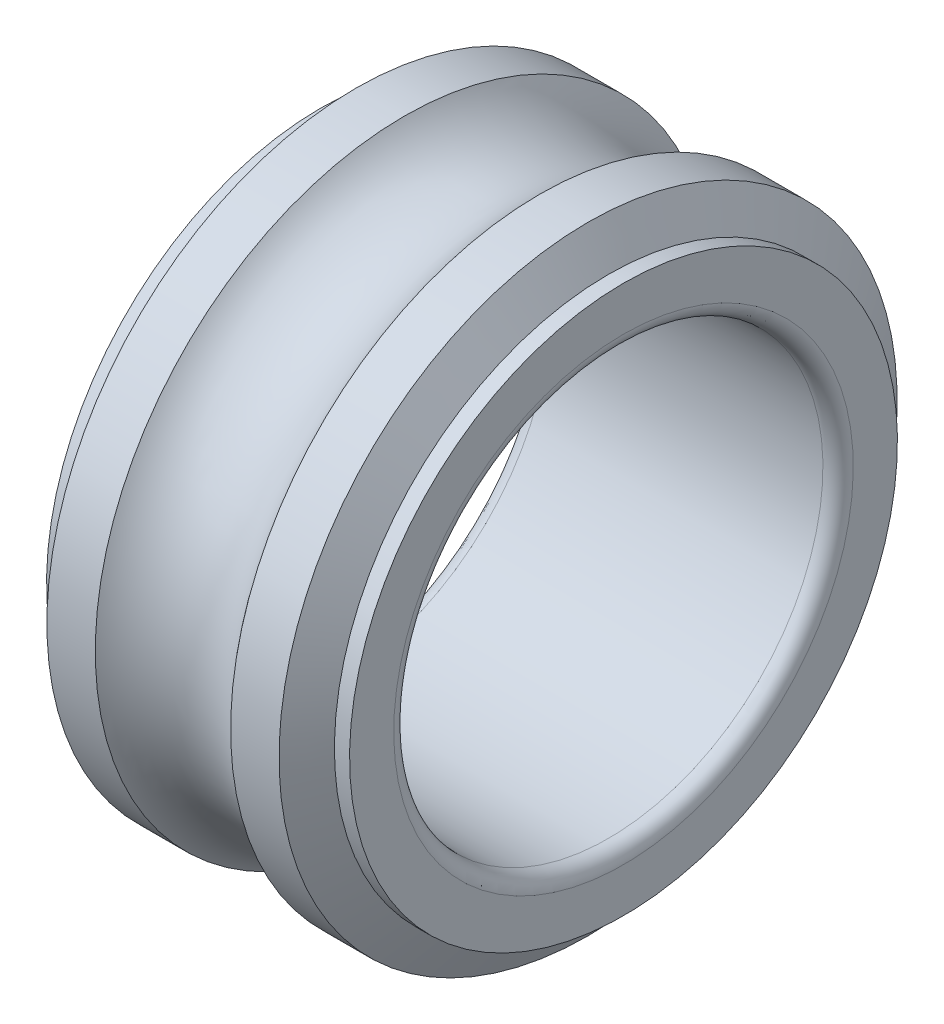
ISO-10303-21;
HEADER;
FILE_DESCRIPTION(('STEP AP214'),'2;1');
FILE_NAME('part.step','',(''),(''),'','','');
FILE_SCHEMA(('AUTOMOTIVE_DESIGN { 1 0 10303 214 1 1 1 1 }'));
ENDSEC;
DATA;
#1=APPLICATION_CONTEXT('core data for automotive mechanical design processes');
#2=APPLICATION_PROTOCOL_DEFINITION('international standard','automotive_design',2000,#1);
#3=PRODUCT_CONTEXT('',#1,'mechanical');
#4=PRODUCT('Part','Part','',(#3));
#5=PRODUCT_RELATED_PRODUCT_CATEGORY('part','',(#4));
#6=PRODUCT_DEFINITION_FORMATION('','',#4);
#7=PRODUCT_DEFINITION_CONTEXT('part definition',#1,'design');
#8=PRODUCT_DEFINITION('design','',#6,#7);
#9=PRODUCT_DEFINITION_SHAPE('','',#8);
#10=(LENGTH_UNIT() NAMED_UNIT(*) SI_UNIT(.MILLI.,.METRE.));
#11=(NAMED_UNIT(*) PLANE_ANGLE_UNIT() SI_UNIT($,.RADIAN.));
#12=(NAMED_UNIT(*) SI_UNIT($,.STERADIAN.) SOLID_ANGLE_UNIT());
#13=UNCERTAINTY_MEASURE_WITH_UNIT(LENGTH_MEASURE(1.E-05),#10,'distance_accuracy_value','');
#14=(GEOMETRIC_REPRESENTATION_CONTEXT(3) GLOBAL_UNCERTAINTY_ASSIGNED_CONTEXT((#13)) GLOBAL_UNIT_ASSIGNED_CONTEXT((#10,
#11,#12)) REPRESENTATION_CONTEXT('',''));
#15=CARTESIAN_POINT('',(0.,0.,0.));
#16=DIRECTION('',(0.,0.,1.));
#17=DIRECTION('',(1.,0.,0.));
#18=AXIS2_PLACEMENT_3D('',#15,#16,#17);
#19=CARTESIAN_POINT('',(6.9096853907283,0.,0.));
#20=DIRECTION('',(-1.,0.,0.));
#21=DIRECTION('',(0.,1.,0.));
#22=AXIS2_PLACEMENT_3D('',#19,#20,#21);
#23=CYLINDRICAL_SURFACE('',#22,3.06);
#24=CARTESIAN_POINT('',(6.67,0.,0.));
#25=DIRECTION('',(1.,0.,0.));
#26=DIRECTION('',(0.,1.,0.));
#27=AXIS2_PLACEMENT_3D('',#24,#25,#26);
#28=CIRCLE('',#27,3.06);
#29=CARTESIAN_POINT('',(6.67,3.06,0.));
#30=VERTEX_POINT('',#29);
#31=EDGE_CURVE('E11',#30,#30,#28,.T.);
#32=ORIENTED_EDGE('',*,*,#31,.T.);
#33=EDGE_LOOP('',(#32));
#34=FACE_BOUND('',#33,.T.);
#35=CARTESIAN_POINT('',(7.1493707814566,0.,0.));
#36=DIRECTION('',(1.,0.,0.));
#37=DIRECTION('',(0.,1.,0.));
#38=AXIS2_PLACEMENT_3D('',#35,#36,#37);
#39=CIRCLE('',#38,3.06);
#40=CARTESIAN_POINT('',(7.1493707814566,3.06,0.));
#41=VERTEX_POINT('',#40);
#42=EDGE_CURVE('E92',#41,#41,#39,.T.);
#43=ORIENTED_EDGE('',*,*,#42,.F.);
#44=EDGE_LOOP('',(#43));
#45=FACE_BOUND('',#44,.T.);
#46=ADVANCED_FACE('F34',(#34,#45),#23,.T.);
#47=CARTESIAN_POINT('',(6.,0.,0.));
#48=DIRECTION('',(1.,0.,0.));
#49=DIRECTION('',(0.,0.,-1.));
#50=AXIS2_PLACEMENT_3D('',#47,#48,#49);
#51=TOROIDAL_SURFACE('',#50,3.5625,0.8375);
#52=CARTESIAN_POINT('',(5.33,0.,0.));
#53=DIRECTION('',(1.,0.,0.));
#54=DIRECTION('',(0.,1.,0.));
#55=AXIS2_PLACEMENT_3D('',#52,#53,#54);
#56=CIRCLE('',#55,3.06);
#57=CARTESIAN_POINT('',(5.33,3.06,0.));
#58=VERTEX_POINT('',#57);
#59=EDGE_CURVE('E43',#58,#58,#56,.T.);
#60=ORIENTED_EDGE('',*,*,#59,.T.);
#61=EDGE_LOOP('',(#60));
#62=FACE_BOUND('',#61,.T.);
#63=ORIENTED_EDGE('',*,*,#31,.F.);
#64=EDGE_LOOP('',(#63));
#65=FACE_BOUND('',#64,.T.);
#66=ADVANCED_FACE('F112',(#62,#65),#51,.F.);
#67=CARTESIAN_POINT('',(5.0903146092717,0.,0.));
#68=DIRECTION('',(-1.,0.,0.));
#69=DIRECTION('',(0.,1.,0.));
#70=AXIS2_PLACEMENT_3D('',#67,#68,#69);
#71=CYLINDRICAL_SURFACE('',#70,3.06);
#72=CARTESIAN_POINT('',(4.85062921854339,0.,0.));
#73=DIRECTION('',(1.,0.,0.));
#74=DIRECTION('',(0.,1.,0.));
#75=AXIS2_PLACEMENT_3D('',#72,#73,#74);
#76=CIRCLE('',#75,3.06);
#77=CARTESIAN_POINT('',(4.85062921854339,3.06,0.));
#78=VERTEX_POINT('',#77);
#79=EDGE_CURVE('E96',#78,#78,#76,.T.);
#80=ORIENTED_EDGE('',*,*,#79,.T.);
#81=EDGE_LOOP('',(#80));
#82=FACE_BOUND('',#81,.T.);
#83=ORIENTED_EDGE('',*,*,#59,.F.);
#84=EDGE_LOOP('',(#83));
#85=FACE_BOUND('',#84,.T.);
#86=ADVANCED_FACE('F117',(#82,#85),#71,.T.);
#87=CARTESIAN_POINT('',(4.7503146092717,0.,0.));
#88=DIRECTION('',(1.,0.,0.));
#89=DIRECTION('',(0.,1.,0.));
#90=AXIS2_PLACEMENT_3D('',#87,#88,#89);
#91=CONICAL_SURFACE('',#90,2.88625,1.0471975511966);
#92=CARTESIAN_POINT('',(4.65,0.,0.));
#93=DIRECTION('',(1.,0.,0.));
#94=DIRECTION('',(0.,1.,0.));
#95=AXIS2_PLACEMENT_3D('',#92,#93,#94);
#96=CIRCLE('',#95,2.7125);
#97=CARTESIAN_POINT('',(4.65,2.7125,0.));
#98=VERTEX_POINT('',#97);
#99=EDGE_CURVE('E102',#98,#98,#96,.T.);
#100=ORIENTED_EDGE('',*,*,#99,.T.);
#101=EDGE_LOOP('',(#100));
#102=FACE_BOUND('',#101,.T.);
#103=ORIENTED_EDGE('',*,*,#79,.F.);
#104=EDGE_LOOP('',(#103));
#105=FACE_BOUND('',#104,.T.);
#106=ADVANCED_FACE('F126',(#102,#105),#91,.T.);
#107=CARTESIAN_POINT('',(4.575,0.,0.));
#108=DIRECTION('',(-1.,0.,0.));
#109=DIRECTION('',(0.,1.,0.));
#110=AXIS2_PLACEMENT_3D('',#107,#108,#109);
#111=CYLINDRICAL_SURFACE('',#110,2.7125);
#112=CARTESIAN_POINT('',(4.5,0.,0.));
#113=DIRECTION('',(1.,0.,0.));
#114=DIRECTION('',(0.,1.,0.));
#115=AXIS2_PLACEMENT_3D('',#112,#113,#114);
#116=CIRCLE('',#115,2.7125);
#117=CARTESIAN_POINT('',(4.5,2.7125,0.));
#118=VERTEX_POINT('',#117);
#119=EDGE_CURVE('E38',#118,#118,#116,.T.);
#120=ORIENTED_EDGE('',*,*,#119,.T.);
#121=EDGE_LOOP('',(#120));
#122=FACE_BOUND('',#121,.T.);
#123=ORIENTED_EDGE('',*,*,#99,.F.);
#124=EDGE_LOOP('',(#123));
#125=FACE_BOUND('',#124,.T.);
#126=ADVANCED_FACE('F129',(#122,#125),#111,.T.);
#127=CARTESIAN_POINT('',(4.5,2.49375,0.));
#128=DIRECTION('',(-1.,0.,0.));
#129=DIRECTION('',(0.,-1.,0.));
#130=AXIS2_PLACEMENT_3D('',#127,#128,#129);
#131=PLANE('',#130);
#132=CARTESIAN_POINT('',(4.5,0.,0.));
#133=DIRECTION('',(1.,0.,0.));
#134=DIRECTION('',(0.,1.,0.));
#135=AXIS2_PLACEMENT_3D('',#132,#133,#134);
#136=CIRCLE('',#135,2.275);
#137=CARTESIAN_POINT('',(4.5,2.275,0.));
#138=VERTEX_POINT('',#137);
#139=EDGE_CURVE('E97',#138,#138,#136,.T.);
#140=ORIENTED_EDGE('',*,*,#139,.T.);
#141=EDGE_LOOP('',(#140));
#142=FACE_BOUND('',#141,.T.);
#143=ORIENTED_EDGE('',*,*,#119,.F.);
#144=EDGE_LOOP('',(#143));
#145=FACE_BOUND('',#144,.T.);
#146=ADVANCED_FACE('F137',(#142,#145),#131,.T.);
#147=CARTESIAN_POINT('',(4.65,0.,0.));
#148=DIRECTION('',(1.,0.,0.));
#149=DIRECTION('',(0.,0.,-1.));
#150=AXIS2_PLACEMENT_3D('',#147,#148,#149);
#151=TOROIDAL_SURFACE('',#150,2.275,0.15);
#152=CARTESIAN_POINT('',(4.65,0.,0.));
#153=DIRECTION('',(1.,0.,0.));
#154=DIRECTION('',(0.,1.,0.));
#155=AXIS2_PLACEMENT_3D('',#152,#153,#154);
#156=CIRCLE('',#155,2.125);
#157=CARTESIAN_POINT('',(4.65,2.125,0.));
#158=VERTEX_POINT('',#157);
#159=EDGE_CURVE('E91',#158,#158,#156,.T.);
#160=ORIENTED_EDGE('',*,*,#159,.T.);
#161=EDGE_LOOP('',(#160));
#162=FACE_BOUND('',#161,.T.);
#163=ORIENTED_EDGE('',*,*,#139,.F.);
#164=EDGE_LOOP('',(#163));
#165=FACE_BOUND('',#164,.T.);
#166=ADVANCED_FACE('F134',(#162,#165),#151,.T.);
#167=CARTESIAN_POINT('',(6.,0.,0.));
#168=DIRECTION('',(-1.,0.,0.));
#169=DIRECTION('',(0.,1.,0.));
#170=AXIS2_PLACEMENT_3D('',#167,#168,#169);
#171=CYLINDRICAL_SURFACE('',#170,2.125);
#172=CARTESIAN_POINT('',(7.35,0.,0.));
#173=DIRECTION('',(1.,0.,0.));
#174=DIRECTION('',(0.,1.,0.));
#175=AXIS2_PLACEMENT_3D('',#172,#173,#174);
#176=CIRCLE('',#175,2.125);
#177=CARTESIAN_POINT('',(7.35,2.125,0.));
#178=VERTEX_POINT('',#177);
#179=EDGE_CURVE('E89',#178,#178,#176,.T.);
#180=ORIENTED_EDGE('',*,*,#179,.T.);
#181=EDGE_LOOP('',(#180));
#182=FACE_BOUND('',#181,.T.);
#183=ORIENTED_EDGE('',*,*,#159,.F.);
#184=EDGE_LOOP('',(#183));
#185=FACE_BOUND('',#184,.T.);
#186=ADVANCED_FACE('F36',(#182,#185),#171,.F.);
#187=CARTESIAN_POINT('',(7.35,0.,0.));
#188=DIRECTION('',(1.,0.,0.));
#189=DIRECTION('',(0.,0.,-1.));
#190=AXIS2_PLACEMENT_3D('',#187,#188,#189);
#191=TOROIDAL_SURFACE('',#190,2.275,0.15);
#192=CARTESIAN_POINT('',(7.5,0.,0.));
#193=DIRECTION('',(1.,0.,0.));
#194=DIRECTION('',(0.,1.,0.));
#195=AXIS2_PLACEMENT_3D('',#192,#193,#194);
#196=CIRCLE('',#195,2.275);
#197=CARTESIAN_POINT('',(7.5,2.275,0.));
#198=VERTEX_POINT('',#197);
#199=EDGE_CURVE('E85',#198,#198,#196,.T.);
#200=ORIENTED_EDGE('',*,*,#199,.T.);
#201=EDGE_LOOP('',(#200));
#202=FACE_BOUND('',#201,.T.);
#203=ORIENTED_EDGE('',*,*,#179,.F.);
#204=EDGE_LOOP('',(#203));
#205=FACE_BOUND('',#204,.T.);
#206=ADVANCED_FACE('F86',(#202,#205),#191,.T.);
#207=CARTESIAN_POINT('',(7.5,2.49375,0.));
#208=DIRECTION('',(1.,0.,0.));
#209=DIRECTION('',(0.,1.,0.));
#210=AXIS2_PLACEMENT_3D('',#207,#208,#209);
#211=PLANE('',#210);
#212=CARTESIAN_POINT('',(7.5,0.,0.));
#213=DIRECTION('',(1.,0.,0.));
#214=DIRECTION('',(0.,1.,0.));
#215=AXIS2_PLACEMENT_3D('',#212,#213,#214);
#216=CIRCLE('',#215,2.7125);
#217=CARTESIAN_POINT('',(7.5,2.7125,0.));
#218=VERTEX_POINT('',#217);
#219=EDGE_CURVE('E81',#218,#218,#216,.T.);
#220=ORIENTED_EDGE('',*,*,#219,.T.);
#221=EDGE_LOOP('',(#220));
#222=FACE_BOUND('',#221,.T.);
#223=ORIENTED_EDGE('',*,*,#199,.F.);
#224=EDGE_LOOP('',(#223));
#225=FACE_BOUND('',#224,.T.);
#226=ADVANCED_FACE('F124',(#222,#225),#211,.T.);
#227=CARTESIAN_POINT('',(7.425,0.,0.));
#228=DIRECTION('',(-1.,0.,0.));
#229=DIRECTION('',(0.,1.,0.));
#230=AXIS2_PLACEMENT_3D('',#227,#228,#229);
#231=CYLINDRICAL_SURFACE('',#230,2.7125);
#232=CARTESIAN_POINT('',(7.35,0.,0.));
#233=DIRECTION('',(1.,0.,0.));
#234=DIRECTION('',(0.,1.,0.));
#235=AXIS2_PLACEMENT_3D('',#232,#233,#234);
#236=CIRCLE('',#235,2.7125);
#237=CARTESIAN_POINT('',(7.35,2.7125,0.));
#238=VERTEX_POINT('',#237);
#239=EDGE_CURVE('E100',#238,#238,#236,.T.);
#240=ORIENTED_EDGE('',*,*,#239,.T.);
#241=EDGE_LOOP('',(#240));
#242=FACE_BOUND('',#241,.T.);
#243=ORIENTED_EDGE('',*,*,#219,.F.);
#244=EDGE_LOOP('',(#243));
#245=FACE_BOUND('',#244,.T.);
#246=ADVANCED_FACE('F122',(#242,#245),#231,.T.);
#247=CARTESIAN_POINT('',(7.2496853907283,0.,0.));
#248=DIRECTION('',(-1.,0.,0.));
#249=DIRECTION('',(0.,1.,0.));
#250=AXIS2_PLACEMENT_3D('',#247,#248,#249);
#251=CONICAL_SURFACE('',#250,2.88625,1.0471975511966);
#252=ORIENTED_EDGE('',*,*,#42,.T.);
#253=EDGE_LOOP('',(#252));
#254=FACE_BOUND('',#253,.T.);
#255=ORIENTED_EDGE('',*,*,#239,.F.);
#256=EDGE_LOOP('',(#255));
#257=FACE_BOUND('',#256,.T.);
#258=ADVANCED_FACE('F108',(#254,#257),#251,.T.);
#259=CLOSED_SHELL('',(#46,#66,#86,#106,#126,#146,#166,#186,#206,#226,#246,#258));
#260=MANIFOLD_SOLID_BREP('B2',#259);
#261=ADVANCED_BREP_SHAPE_REPRESENTATION('',(#18,#260),#14);
#262=SHAPE_DEFINITION_REPRESENTATION(#9,#261);
ENDSEC;
END-ISO-10303-21;
